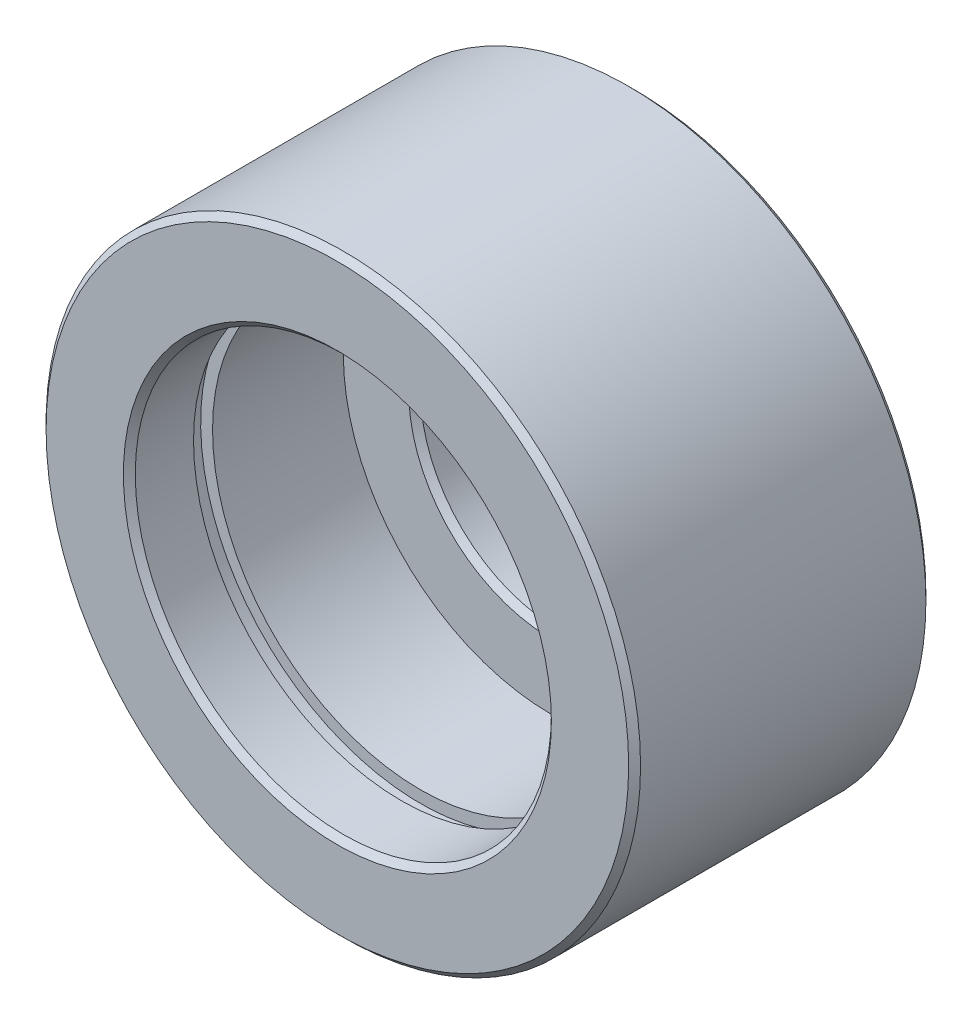
ISO-10303-21;
HEADER;
FILE_DESCRIPTION(('STEP AP214'),'2;1');
FILE_NAME('part.step','',(''),(''),'','','');
FILE_SCHEMA(('AUTOMOTIVE_DESIGN { 1 0 10303 214 1 1 1 1 }'));
ENDSEC;
DATA;
#1=APPLICATION_CONTEXT('core data for automotive mechanical design processes');
#2=APPLICATION_PROTOCOL_DEFINITION('international standard','automotive_design',2000,#1);
#3=PRODUCT_CONTEXT('',#1,'mechanical');
#4=PRODUCT('Part','Part','',(#3));
#5=PRODUCT_RELATED_PRODUCT_CATEGORY('part','',(#4));
#6=PRODUCT_DEFINITION_FORMATION('','',#4);
#7=PRODUCT_DEFINITION_CONTEXT('part definition',#1,'design');
#8=PRODUCT_DEFINITION('design','',#6,#7);
#9=PRODUCT_DEFINITION_SHAPE('','',#8);
#10=(LENGTH_UNIT() NAMED_UNIT(*) SI_UNIT(.MILLI.,.METRE.));
#11=(NAMED_UNIT(*) PLANE_ANGLE_UNIT() SI_UNIT($,.RADIAN.));
#12=(NAMED_UNIT(*) SI_UNIT($,.STERADIAN.) SOLID_ANGLE_UNIT());
#13=UNCERTAINTY_MEASURE_WITH_UNIT(LENGTH_MEASURE(1.E-05),#10,'distance_accuracy_value','');
#14=(GEOMETRIC_REPRESENTATION_CONTEXT(3) GLOBAL_UNCERTAINTY_ASSIGNED_CONTEXT((#13)) GLOBAL_UNIT_ASSIGNED_CONTEXT((#10,
#11,#12)) REPRESENTATION_CONTEXT('',''));
#15=CARTESIAN_POINT('',(0.,0.,0.));
#16=DIRECTION('',(0.,0.,1.));
#17=DIRECTION('',(1.,0.,0.));
#18=AXIS2_PLACEMENT_3D('',#15,#16,#17);
#19=CARTESIAN_POINT('',(0.,0.,-5.5));
#20=DIRECTION('',(0.,0.,1.));
#21=DIRECTION('',(1.,0.,0.));
#22=AXIS2_PLACEMENT_3D('',#19,#20,#21);
#23=CYLINDRICAL_SURFACE('',#22,17.5);
#24=CARTESIAN_POINT('',(0.,0.,5.5));
#25=DIRECTION('',(0.,0.,-1.));
#26=DIRECTION('',(0.,1.,0.));
#27=AXIS2_PLACEMENT_3D('',#24,#25,#26);
#28=CIRCLE('',#27,17.5);
#29=CARTESIAN_POINT('',(0.,17.5,5.5));
#30=VERTEX_POINT('',#29);
#31=EDGE_CURVE('E46',#30,#30,#28,.F.);
#32=ORIENTED_EDGE('',*,*,#31,.T.);
#33=EDGE_LOOP('',(#32));
#34=FACE_BOUND('',#33,.T.);
#35=CARTESIAN_POINT('',(0.,0.,-5.5));
#36=DIRECTION('',(0.,0.,1.));
#37=DIRECTION('',(1.,0.,0.));
#38=AXIS2_PLACEMENT_3D('',#35,#36,#37);
#39=CIRCLE('',#38,17.5);
#40=CARTESIAN_POINT('',(17.5,0.,-5.5));
#41=VERTEX_POINT('',#40);
#42=EDGE_CURVE('E64',#41,#41,#39,.T.);
#43=ORIENTED_EDGE('',*,*,#42,.F.);
#44=EDGE_LOOP('',(#43));
#45=FACE_BOUND('',#44,.T.);
#46=ADVANCED_FACE('F41',(#34,#45),#23,.F.);
#47=CARTESIAN_POINT('',(0.,0.,-12.5));
#48=DIRECTION('',(0.,0.,1.));
#49=DIRECTION('',(1.,0.,0.));
#50=AXIS2_PLACEMENT_3D('',#47,#48,#49);
#51=CYLINDRICAL_SURFACE('',#50,11.5);
#52=CARTESIAN_POINT('',(0.,0.,-12.));
#53=DIRECTION('',(0.,0.,1.));
#54=DIRECTION('',(1.,0.,0.));
#55=AXIS2_PLACEMENT_3D('',#52,#53,#54);
#56=CIRCLE('',#55,11.5);
#57=CARTESIAN_POINT('',(11.5,0.,-12.));
#58=VERTEX_POINT('',#57);
#59=EDGE_CURVE('E89',#58,#58,#56,.F.);
#60=ORIENTED_EDGE('',*,*,#59,.T.);
#61=EDGE_LOOP('',(#60));
#62=FACE_BOUND('',#61,.T.);
#63=CARTESIAN_POINT('',(0.,0.,-6.));
#64=DIRECTION('',(0.,0.,1.));
#65=DIRECTION('',(1.,0.,0.));
#66=AXIS2_PLACEMENT_3D('',#63,#64,#65);
#67=CIRCLE('',#66,11.5);
#68=CARTESIAN_POINT('',(11.5,0.,-6.));
#69=VERTEX_POINT('',#68);
#70=EDGE_CURVE('E87',#69,#69,#67,.T.);
#71=ORIENTED_EDGE('',*,*,#70,.T.);
#72=EDGE_LOOP('',(#71));
#73=FACE_BOUND('',#72,.T.);
#74=ADVANCED_FACE('F118',(#62,#73),#51,.F.);
#75=CARTESIAN_POINT('',(0.,0.,12.5));
#76=DIRECTION('',(0.,0.,-1.));
#77=DIRECTION('',(-1.,0.,0.));
#78=AXIS2_PLACEMENT_3D('',#75,#76,#77);
#79=CYLINDRICAL_SURFACE('',#78,25.);
#80=CARTESIAN_POINT('',(0.,0.,-12.));
#81=DIRECTION('',(0.,0.,1.));
#82=DIRECTION('',(1.,0.,0.));
#83=AXIS2_PLACEMENT_3D('',#80,#81,#82);
#84=CIRCLE('',#83,25.);
#85=CARTESIAN_POINT('',(25.,0.,-12.));
#86=VERTEX_POINT('',#85);
#87=EDGE_CURVE('E78',#86,#86,#84,.T.);
#88=ORIENTED_EDGE('',*,*,#87,.T.);
#89=EDGE_LOOP('',(#88));
#90=FACE_BOUND('',#89,.T.);
#91=CARTESIAN_POINT('',(0.,0.,12.));
#92=DIRECTION('',(0.,0.,1.));
#93=DIRECTION('',(1.,0.,0.));
#94=AXIS2_PLACEMENT_3D('',#91,#92,#93);
#95=CIRCLE('',#94,25.);
#96=CARTESIAN_POINT('',(25.,0.,12.));
#97=VERTEX_POINT('',#96);
#98=EDGE_CURVE('E73',#97,#97,#95,.F.);
#99=ORIENTED_EDGE('',*,*,#98,.T.);
#100=EDGE_LOOP('',(#99));
#101=FACE_BOUND('',#100,.T.);
#102=ADVANCED_FACE('F130',(#90,#101),#79,.T.);
#103=CARTESIAN_POINT('',(0.,0.,12.5));
#104=DIRECTION('',(0.,0.,1.));
#105=DIRECTION('',(1.,0.,0.));
#106=AXIS2_PLACEMENT_3D('',#103,#104,#105);
#107=PLANE('',#106);
#108=CARTESIAN_POINT('',(0.,0.,12.5));
#109=DIRECTION('',(0.,0.,1.));
#110=DIRECTION('',(1.,0.,0.));
#111=AXIS2_PLACEMENT_3D('',#108,#109,#110);
#112=CIRCLE('',#111,24.5);
#113=CARTESIAN_POINT('',(24.5,0.,12.5));
#114=VERTEX_POINT('',#113);
#115=EDGE_CURVE('E54',#114,#114,#112,.T.);
#116=ORIENTED_EDGE('',*,*,#115,.T.);
#117=EDGE_LOOP('',(#116));
#118=FACE_BOUND('',#117,.T.);
#119=CARTESIAN_POINT('',(0.,0.,12.5));
#120=DIRECTION('',(0.,0.,1.));
#121=DIRECTION('',(1.,0.,0.));
#122=AXIS2_PLACEMENT_3D('',#119,#120,#121);
#123=CIRCLE('',#122,18.);
#124=CARTESIAN_POINT('',(18.,0.,12.5));
#125=VERTEX_POINT('',#124);
#126=EDGE_CURVE('E91',#125,#125,#123,.F.);
#127=ORIENTED_EDGE('',*,*,#126,.T.);
#128=EDGE_LOOP('',(#127));
#129=FACE_BOUND('',#128,.T.);
#130=ADVANCED_FACE('F98',(#118,#129),#107,.T.);
#131=CARTESIAN_POINT('',(0.,0.,-12.5));
#132=DIRECTION('',(0.,0.,1.));
#133=DIRECTION('',(1.,0.,0.));
#134=AXIS2_PLACEMENT_3D('',#131,#132,#133);
#135=PLANE('',#134);
#136=CARTESIAN_POINT('',(0.,0.,-12.5));
#137=DIRECTION('',(0.,0.,1.));
#138=DIRECTION('',(1.,0.,0.));
#139=AXIS2_PLACEMENT_3D('',#136,#137,#138);
#140=CIRCLE('',#139,24.5);
#141=CARTESIAN_POINT('',(24.5,0.,-12.5));
#142=VERTEX_POINT('',#141);
#143=EDGE_CURVE('E83',#142,#142,#140,.F.);
#144=ORIENTED_EDGE('',*,*,#143,.T.);
#145=EDGE_LOOP('',(#144));
#146=FACE_BOUND('',#145,.T.);
#147=CARTESIAN_POINT('',(0.,0.,-12.5));
#148=DIRECTION('',(0.,0.,1.));
#149=DIRECTION('',(1.,0.,0.));
#150=AXIS2_PLACEMENT_3D('',#147,#148,#149);
#151=CIRCLE('',#150,12.);
#152=CARTESIAN_POINT('',(12.,0.,-12.5));
#153=VERTEX_POINT('',#152);
#154=EDGE_CURVE('E81',#153,#153,#151,.T.);
#155=ORIENTED_EDGE('',*,*,#154,.T.);
#156=EDGE_LOOP('',(#155));
#157=FACE_BOUND('',#156,.T.);
#158=ADVANCED_FACE('F140',(#146,#157),#135,.F.);
#159=CARTESIAN_POINT('',(0.,0.,-5.5));
#160=DIRECTION('',(0.,0.,1.));
#161=DIRECTION('',(1.,0.,0.));
#162=AXIS2_PLACEMENT_3D('',#159,#160,#161);
#163=PLANE('',#162);
#164=CARTESIAN_POINT('',(0.,0.,-5.5));
#165=DIRECTION('',(0.,0.,1.));
#166=DIRECTION('',(1.,0.,0.));
#167=AXIS2_PLACEMENT_3D('',#164,#165,#166);
#168=CIRCLE('',#167,12.);
#169=CARTESIAN_POINT('',(12.,0.,-5.5));
#170=VERTEX_POINT('',#169);
#171=EDGE_CURVE('E10',#170,#170,#168,.F.);
#172=ORIENTED_EDGE('',*,*,#171,.T.);
#173=EDGE_LOOP('',(#172));
#174=FACE_BOUND('',#173,.T.);
#175=ORIENTED_EDGE('',*,*,#42,.T.);
#176=EDGE_LOOP('',(#175));
#177=FACE_BOUND('',#176,.T.);
#178=ADVANCED_FACE('F135',(#174,#177),#163,.T.);
#179=CARTESIAN_POINT('',(0.,0.,7.1));
#180=DIRECTION('',(0.,0.,1.));
#181=DIRECTION('',(0.,-1.,0.));
#182=AXIS2_PLACEMENT_3D('',#179,#180,#181);
#183=CIRCLE('',#182,17.5);
#184=CARTESIAN_POINT('',(0.,-17.5,7.1));
#185=VERTEX_POINT('',#184);
#186=EDGE_CURVE('E59',#185,#185,#183,.F.);
#187=ORIENTED_EDGE('',*,*,#186,.T.);
#188=EDGE_LOOP('',(#187));
#189=FACE_BOUND('',#188,.T.);
#190=CARTESIAN_POINT('',(0.,0.,12.));
#191=DIRECTION('',(0.,0.,1.));
#192=DIRECTION('',(1.,0.,0.));
#193=AXIS2_PLACEMENT_3D('',#190,#191,#192);
#194=CIRCLE('',#193,17.5);
#195=CARTESIAN_POINT('',(17.5,0.,12.));
#196=VERTEX_POINT('',#195);
#197=EDGE_CURVE('E49',#196,#196,#194,.T.);
#198=ORIENTED_EDGE('',*,*,#197,.T.);
#199=EDGE_LOOP('',(#198));
#200=FACE_BOUND('',#199,.T.);
#201=ADVANCED_FACE('F123',(#189,#200),#23,.F.);
#202=CARTESIAN_POINT('',(0.,0.,-12.));
#203=DIRECTION('',(0.,0.,1.));
#204=DIRECTION('',(1.,0.,0.));
#205=AXIS2_PLACEMENT_3D('',#202,#203,#204);
#206=CONICAL_SURFACE('',#205,25.,0.785398163397455);
#207=ORIENTED_EDGE('',*,*,#143,.F.);
#208=EDGE_LOOP('',(#207));
#209=FACE_BOUND('',#208,.T.);
#210=ORIENTED_EDGE('',*,*,#87,.F.);
#211=EDGE_LOOP('',(#210));
#212=FACE_BOUND('',#211,.T.);
#213=ADVANCED_FACE('F115',(#209,#212),#206,.T.);
#214=CARTESIAN_POINT('',(0.,0.,-12.5));
#215=DIRECTION('',(0.,0.,-1.));
#216=DIRECTION('',(-1.,0.,0.));
#217=AXIS2_PLACEMENT_3D('',#214,#215,#216);
#218=CONICAL_SURFACE('',#217,12.,0.785398163397445);
#219=ORIENTED_EDGE('',*,*,#59,.F.);
#220=EDGE_LOOP('',(#219));
#221=FACE_BOUND('',#220,.T.);
#222=ORIENTED_EDGE('',*,*,#154,.F.);
#223=EDGE_LOOP('',(#222));
#224=FACE_BOUND('',#223,.T.);
#225=ADVANCED_FACE('F102',(#221,#224),#218,.F.);
#226=CARTESIAN_POINT('',(0.,0.,12.5));
#227=DIRECTION('',(0.,0.,-1.));
#228=DIRECTION('',(-1.,0.,0.));
#229=AXIS2_PLACEMENT_3D('',#226,#227,#228);
#230=CONICAL_SURFACE('',#229,24.5,0.785398163397438);
#231=ORIENTED_EDGE('',*,*,#98,.F.);
#232=EDGE_LOOP('',(#231));
#233=FACE_BOUND('',#232,.T.);
#234=ORIENTED_EDGE('',*,*,#115,.F.);
#235=EDGE_LOOP('',(#234));
#236=FACE_BOUND('',#235,.T.);
#237=ADVANCED_FACE('F101',(#233,#236),#230,.T.);
#238=CARTESIAN_POINT('',(0.,0.,12.));
#239=DIRECTION('',(0.,0.,1.));
#240=DIRECTION('',(1.,0.,0.));
#241=AXIS2_PLACEMENT_3D('',#238,#239,#240);
#242=CONICAL_SURFACE('',#241,17.5,0.785398163397459);
#243=ORIENTED_EDGE('',*,*,#126,.F.);
#244=EDGE_LOOP('',(#243));
#245=FACE_BOUND('',#244,.T.);
#246=ORIENTED_EDGE('',*,*,#197,.F.);
#247=EDGE_LOOP('',(#246));
#248=FACE_BOUND('',#247,.T.);
#249=ADVANCED_FACE('F103',(#245,#248),#242,.F.);
#250=CARTESIAN_POINT('',(0.,0.,-5.5));
#251=DIRECTION('',(0.,0.,1.));
#252=DIRECTION('',(1.,0.,0.));
#253=AXIS2_PLACEMENT_3D('',#250,#251,#252);
#254=CONICAL_SURFACE('',#253,12.,0.785398163397445);
#255=ORIENTED_EDGE('',*,*,#70,.F.);
#256=EDGE_LOOP('',(#255));
#257=FACE_BOUND('',#256,.T.);
#258=ORIENTED_EDGE('',*,*,#171,.F.);
#259=EDGE_LOOP('',(#258));
#260=FACE_BOUND('',#259,.T.);
#261=ADVANCED_FACE('F42',(#257,#260),#254,.F.);
#262=CARTESIAN_POINT('',(0.,18.5,5.5));
#263=DIRECTION('',(0.,0.,-1.));
#264=DIRECTION('',(0.,1.,0.));
#265=AXIS2_PLACEMENT_3D('',#262,#263,#264);
#266=PLANE('',#265);
#267=CARTESIAN_POINT('',(0.,0.,5.5));
#268=DIRECTION('',(0.,0.,-1.));
#269=DIRECTION('',(0.,1.,0.));
#270=AXIS2_PLACEMENT_3D('',#267,#268,#269);
#271=CIRCLE('',#270,18.5);
#272=CARTESIAN_POINT('',(0.,18.5,5.5));
#273=VERTEX_POINT('',#272);
#274=EDGE_CURVE('E58',#273,#273,#271,.T.);
#275=ORIENTED_EDGE('',*,*,#274,.F.);
#276=EDGE_LOOP('',(#275));
#277=FACE_BOUND('',#276,.T.);
#278=ORIENTED_EDGE('',*,*,#31,.F.);
#279=EDGE_LOOP('',(#278));
#280=FACE_BOUND('',#279,.T.);
#281=ADVANCED_FACE('F156',(#277,#280),#266,.F.);
#282=CARTESIAN_POINT('',(0.,0.,7.1));
#283=DIRECTION('',(0.,0.,1.));
#284=DIRECTION('',(0.,-1.,0.));
#285=AXIS2_PLACEMENT_3D('',#282,#283,#284);
#286=PLANE('',#285);
#287=CARTESIAN_POINT('',(0.,0.,7.1));
#288=DIRECTION('',(0.,0.,-1.));
#289=DIRECTION('',(0.,1.,0.));
#290=AXIS2_PLACEMENT_3D('',#287,#288,#289);
#291=CIRCLE('',#290,18.5);
#292=CARTESIAN_POINT('',(0.,18.5,7.1));
#293=VERTEX_POINT('',#292);
#294=EDGE_CURVE('E68',#293,#293,#291,.T.);
#295=ORIENTED_EDGE('',*,*,#294,.T.);
#296=EDGE_LOOP('',(#295));
#297=FACE_BOUND('',#296,.T.);
#298=ORIENTED_EDGE('',*,*,#186,.F.);
#299=EDGE_LOOP('',(#298));
#300=FACE_BOUND('',#299,.T.);
#301=ADVANCED_FACE('F152',(#297,#300),#286,.F.);
#302=CARTESIAN_POINT('',(0.,0.,5.5));
#303=DIRECTION('',(0.,0.,-1.));
#304=DIRECTION('',(0.,1.,0.));
#305=AXIS2_PLACEMENT_3D('',#302,#303,#304);
#306=CYLINDRICAL_SURFACE('',#305,18.5);
#307=ORIENTED_EDGE('',*,*,#294,.F.);
#308=EDGE_LOOP('',(#307));
#309=FACE_BOUND('',#308,.T.);
#310=ORIENTED_EDGE('',*,*,#274,.T.);
#311=EDGE_LOOP('',(#310));
#312=FACE_BOUND('',#311,.T.);
#313=ADVANCED_FACE('F151',(#309,#312),#306,.F.);
#314=CLOSED_SHELL('',(#46,#74,#102,#130,#158,#178,#201,#213,#225,#237,#249,#261,#281,#301,#313));
#315=MANIFOLD_SOLID_BREP('B2',#314);
#316=ADVANCED_BREP_SHAPE_REPRESENTATION('',(#18,#315),#14);
#317=SHAPE_DEFINITION_REPRESENTATION(#9,#316);
ENDSEC;
END-ISO-10303-21;
